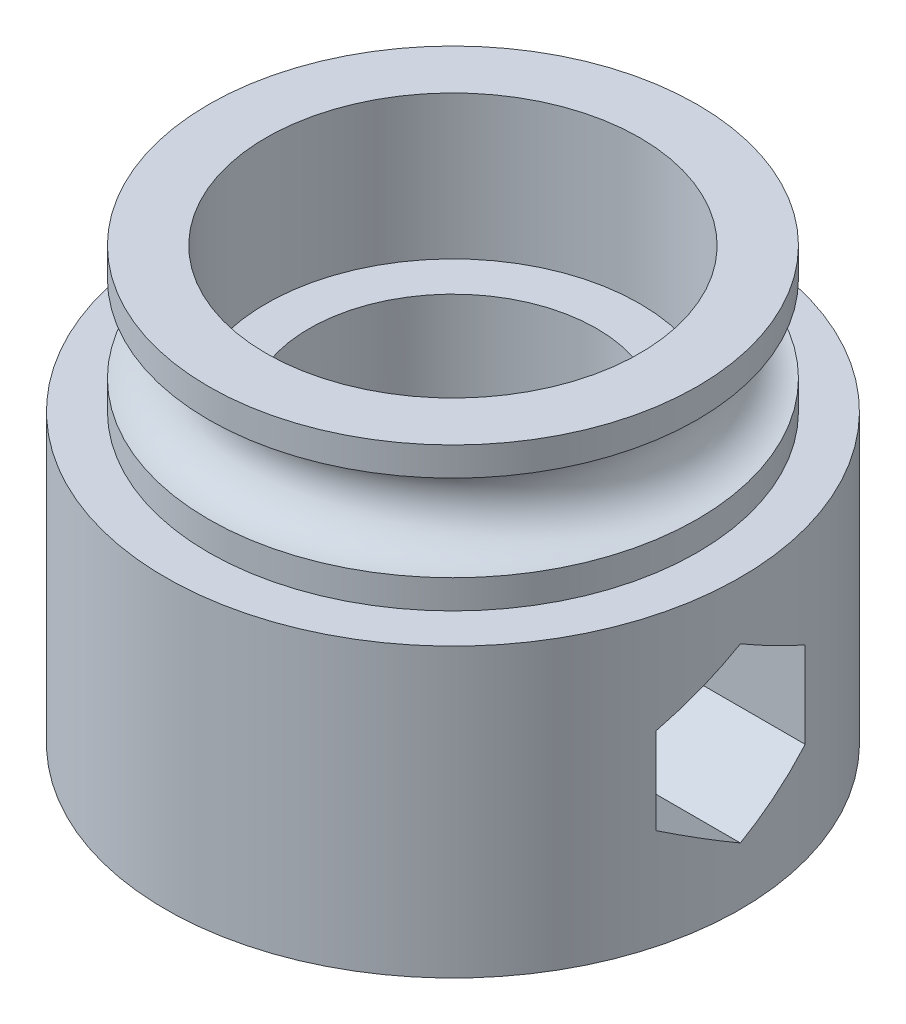
ISO-10303-21;
HEADER;
FILE_DESCRIPTION(('STEP AP214'),'2;1');
FILE_NAME('part.step','',(''),(''),'','','');
FILE_SCHEMA(('AUTOMOTIVE_DESIGN { 1 0 10303 214 1 1 1 1 }'));
ENDSEC;
DATA;
#1=APPLICATION_CONTEXT('core data for automotive mechanical design processes');
#2=APPLICATION_PROTOCOL_DEFINITION('international standard','automotive_design',2000,#1);
#3=PRODUCT_CONTEXT('',#1,'mechanical');
#4=PRODUCT('Part','Part','',(#3));
#5=PRODUCT_RELATED_PRODUCT_CATEGORY('part','',(#4));
#6=PRODUCT_DEFINITION_FORMATION('','',#4);
#7=PRODUCT_DEFINITION_CONTEXT('part definition',#1,'design');
#8=PRODUCT_DEFINITION('design','',#6,#7);
#9=PRODUCT_DEFINITION_SHAPE('','',#8);
#10=(LENGTH_UNIT() NAMED_UNIT(*) SI_UNIT(.MILLI.,.METRE.));
#11=(NAMED_UNIT(*) PLANE_ANGLE_UNIT() SI_UNIT($,.RADIAN.));
#12=(NAMED_UNIT(*) SI_UNIT($,.STERADIAN.) SOLID_ANGLE_UNIT());
#13=UNCERTAINTY_MEASURE_WITH_UNIT(LENGTH_MEASURE(1.E-05),#10,'distance_accuracy_value','');
#14=(GEOMETRIC_REPRESENTATION_CONTEXT(3) GLOBAL_UNCERTAINTY_ASSIGNED_CONTEXT((#13)) GLOBAL_UNIT_ASSIGNED_CONTEXT((#10,
#11,#12)) REPRESENTATION_CONTEXT('',''));
#15=CARTESIAN_POINT('',(0.,0.,0.));
#16=DIRECTION('',(0.,0.,1.));
#17=DIRECTION('',(1.,0.,0.));
#18=AXIS2_PLACEMENT_3D('',#15,#16,#17);
#19=CARTESIAN_POINT('',(0.,31.75,0.));
#20=DIRECTION('',(0.,-1.,0.));
#21=DIRECTION('',(0.,0.,-1.));
#22=AXIS2_PLACEMENT_3D('',#19,#20,#21);
#23=TOROIDAL_SURFACE('',#22,21.59,3.80999999999999);
#24=CARTESIAN_POINT('',(0.,27.94,0.));
#25=DIRECTION('',(0.,-1.,0.));
#26=DIRECTION('',(0.,0.,-1.));
#27=AXIS2_PLACEMENT_3D('',#24,#25,#26);
#28=CIRCLE('',#27,21.59);
#29=CARTESIAN_POINT('',(0.,27.94,-21.59));
#30=VERTEX_POINT('',#29);
#31=EDGE_CURVE('E206',#30,#30,#28,.T.);
#32=ORIENTED_EDGE('',*,*,#31,.F.);
#33=EDGE_LOOP('',(#32));
#34=FACE_BOUND('',#33,.T.);
#35=CARTESIAN_POINT('',(0.,35.56,0.));
#36=DIRECTION('',(0.,-1.,0.));
#37=DIRECTION('',(0.,0.,-1.));
#38=AXIS2_PLACEMENT_3D('',#35,#36,#37);
#39=CIRCLE('',#38,21.59);
#40=CARTESIAN_POINT('',(0.,35.56,-21.59));
#41=VERTEX_POINT('',#40);
#42=EDGE_CURVE('E179',#41,#41,#39,.T.);
#43=ORIENTED_EDGE('',*,*,#42,.T.);
#44=EDGE_LOOP('',(#43));
#45=FACE_BOUND('',#44,.T.);
#46=ADVANCED_FACE('F45',(#34,#45),#23,.F.);
#47=CARTESIAN_POINT('',(0.,0.,0.));
#48=DIRECTION('',(0.,-1.,0.));
#49=DIRECTION('',(0.,0.,-1.));
#50=AXIS2_PLACEMENT_3D('',#47,#48,#49);
#51=CYLINDRICAL_SURFACE('',#50,21.59);
#52=ORIENTED_EDGE('',*,*,#42,.F.);
#53=EDGE_LOOP('',(#52));
#54=FACE_BOUND('',#53,.T.);
#55=CARTESIAN_POINT('',(0.,38.1,0.));
#56=DIRECTION('',(0.,-1.,0.));
#57=DIRECTION('',(0.,0.,-1.));
#58=AXIS2_PLACEMENT_3D('',#55,#56,#57);
#59=CIRCLE('',#58,21.59);
#60=CARTESIAN_POINT('',(0.,38.1,-21.59));
#61=VERTEX_POINT('',#60);
#62=EDGE_CURVE('E182',#61,#61,#59,.T.);
#63=ORIENTED_EDGE('',*,*,#62,.T.);
#64=EDGE_LOOP('',(#63));
#65=FACE_BOUND('',#64,.T.);
#66=ADVANCED_FACE('F283',(#54,#65),#51,.T.);
#67=CARTESIAN_POINT('',(0.,38.1,0.));
#68=DIRECTION('',(0.,-1.,0.));
#69=DIRECTION('',(0.,0.,-1.));
#70=AXIS2_PLACEMENT_3D('',#67,#68,#69);
#71=PLANE('',#70);
#72=ORIENTED_EDGE('',*,*,#62,.F.);
#73=EDGE_LOOP('',(#72));
#74=FACE_BOUND('',#73,.T.);
#75=CARTESIAN_POINT('',(0.,38.1,0.));
#76=DIRECTION('',(0.,-1.,0.));
#77=DIRECTION('',(0.,0.,-1.));
#78=AXIS2_PLACEMENT_3D('',#75,#76,#77);
#79=CIRCLE('',#78,16.51);
#80=CARTESIAN_POINT('',(0.,38.1,-16.51));
#81=VERTEX_POINT('',#80);
#82=EDGE_CURVE('E185',#81,#81,#79,.T.);
#83=ORIENTED_EDGE('',*,*,#82,.T.);
#84=EDGE_LOOP('',(#83));
#85=FACE_BOUND('',#84,.T.);
#86=ADVANCED_FACE('F288',(#74,#85),#71,.F.);
#87=CARTESIAN_POINT('',(0.,0.,0.));
#88=DIRECTION('',(0.,-1.,0.));
#89=DIRECTION('',(0.,0.,-1.));
#90=AXIS2_PLACEMENT_3D('',#87,#88,#89);
#91=CYLINDRICAL_SURFACE('',#90,16.51);
#92=ORIENTED_EDGE('',*,*,#82,.F.);
#93=EDGE_LOOP('',(#92));
#94=FACE_BOUND('',#93,.T.);
#95=CARTESIAN_POINT('',(0.,25.4,0.));
#96=DIRECTION('',(0.,-1.,0.));
#97=DIRECTION('',(0.,0.,-1.));
#98=AXIS2_PLACEMENT_3D('',#95,#96,#97);
#99=CIRCLE('',#98,16.51);
#100=CARTESIAN_POINT('',(0.,25.4,-16.51));
#101=VERTEX_POINT('',#100);
#102=EDGE_CURVE('E188',#101,#101,#99,.T.);
#103=ORIENTED_EDGE('',*,*,#102,.T.);
#104=EDGE_LOOP('',(#103));
#105=FACE_BOUND('',#104,.T.);
#106=ADVANCED_FACE('F298',(#94,#105),#91,.F.);
#107=CARTESIAN_POINT('',(0.,25.4,0.));
#108=DIRECTION('',(0.,-1.,0.));
#109=DIRECTION('',(0.,0.,-1.));
#110=AXIS2_PLACEMENT_3D('',#107,#108,#109);
#111=PLANE('',#110);
#112=ORIENTED_EDGE('',*,*,#102,.F.);
#113=EDGE_LOOP('',(#112));
#114=FACE_BOUND('',#113,.T.);
#115=CARTESIAN_POINT('',(0.,25.4,0.));
#116=DIRECTION('',(0.,-1.,0.));
#117=DIRECTION('',(0.,0.,-1.));
#118=AXIS2_PLACEMENT_3D('',#115,#116,#117);
#119=CIRCLE('',#118,12.7);
#120=CARTESIAN_POINT('',(0.,25.4,-12.7));
#121=VERTEX_POINT('',#120);
#122=EDGE_CURVE('E191',#121,#121,#119,.T.);
#123=ORIENTED_EDGE('',*,*,#122,.T.);
#124=EDGE_LOOP('',(#123));
#125=FACE_BOUND('',#124,.T.);
#126=ADVANCED_FACE('F304',(#114,#125),#111,.F.);
#127=CARTESIAN_POINT('',(0.,0.,0.));
#128=DIRECTION('',(0.,-1.,0.));
#129=DIRECTION('',(0.,0.,-1.));
#130=AXIS2_PLACEMENT_3D('',#127,#128,#129);
#131=CYLINDRICAL_SURFACE('',#130,12.7);
#132=CARTESIAN_POINT('',(0.,20.32,0.));
#133=DIRECTION('',(0.,0.866025403784439,0.5));
#134=DIRECTION('',(0.,-0.5,0.866025403784439));
#135=AXIS2_PLACEMENT_3D('',#132,#133,#134);
#136=ELLIPSE('',#135,14.6646968374165,12.7);
#137=CARTESIAN_POINT('',(-10.8508847565533,16.51,6.59911357683742));
#138=VERTEX_POINT('',#137);
#139=CARTESIAN_POINT('',(-12.7,20.32,0.));
#140=VERTEX_POINT('',#139);
#141=EDGE_CURVE('E231',#138,#140,#136,.F.);
#142=ORIENTED_EDGE('',*,*,#141,.T.);
#143=CARTESIAN_POINT('',(0.,20.32,0.));
#144=DIRECTION('',(0.,0.866025403784439,-0.5));
#145=DIRECTION('',(0.,-0.5,-0.866025403784439));
#146=AXIS2_PLACEMENT_3D('',#143,#144,#145);
#147=ELLIPSE('',#146,14.6646968374165,12.7);
#148=CARTESIAN_POINT('',(-10.8508847565533,16.51,-6.59911357683742));
#149=VERTEX_POINT('',#148);
#150=EDGE_CURVE('E210',#140,#149,#147,.F.);
#151=ORIENTED_EDGE('',*,*,#150,.T.);
#152=DIRECTION('',(0.,-1.,0.));
#153=VECTOR('',#152,1.);
#154=CARTESIAN_POINT('',(-10.8508847565533,0.,-6.59911357683742));
#155=LINE('',#154,#153);
#156=CARTESIAN_POINT('',(-10.8508847565533,8.89,-6.59911357683742));
#157=VERTEX_POINT('',#156);
#158=EDGE_CURVE('E216',#149,#157,#155,.T.);
#159=ORIENTED_EDGE('',*,*,#158,.T.);
#160=CARTESIAN_POINT('',(0.,5.08,0.));
#161=DIRECTION('',(0.,-0.866025403784438,-0.5));
#162=DIRECTION('',(0.,-0.5,0.866025403784439));
#163=AXIS2_PLACEMENT_3D('',#160,#161,#162);
#164=ELLIPSE('',#163,14.6646968374165,12.7);
#165=CARTESIAN_POINT('',(-12.7,5.08,0.));
#166=VERTEX_POINT('',#165);
#167=EDGE_CURVE('E219',#157,#166,#164,.F.);
#168=ORIENTED_EDGE('',*,*,#167,.T.);
#169=CARTESIAN_POINT('',(0.,5.08,0.));
#170=DIRECTION('',(0.,-0.866025403784438,0.5));
#171=DIRECTION('',(0.,-0.5,-0.866025403784439));
#172=AXIS2_PLACEMENT_3D('',#169,#170,#171);
#173=ELLIPSE('',#172,14.6646968374165,12.7);
#174=CARTESIAN_POINT('',(-10.8508847565533,8.89,6.59911357683742));
#175=VERTEX_POINT('',#174);
#176=EDGE_CURVE('E222',#166,#175,#173,.F.);
#177=ORIENTED_EDGE('',*,*,#176,.T.);
#178=DIRECTION('',(0.,-1.,0.));
#179=VECTOR('',#178,1.);
#180=CARTESIAN_POINT('',(-10.8508847565533,0.,6.59911357683742));
#181=LINE('',#180,#179);
#182=EDGE_CURVE('E225',#175,#138,#181,.F.);
#183=ORIENTED_EDGE('',*,*,#182,.T.);
#184=EDGE_LOOP('',(#142,#151,#159,#168,#177,#183));
#185=FACE_BOUND('',#184,.T.);
#186=DIRECTION('',(0.,-1.,0.));
#187=VECTOR('',#186,1.);
#188=CARTESIAN_POINT('',(10.8508847565533,0.,-6.59911357683742));
#189=LINE('',#188,#187);
#190=CARTESIAN_POINT('',(10.8508847565533,8.89,-6.59911357683742));
#191=VERTEX_POINT('',#190);
#192=CARTESIAN_POINT('',(10.8508847565533,16.51,-6.59911357683742));
#193=VERTEX_POINT('',#192);
#194=EDGE_CURVE('E213',#191,#193,#189,.F.);
#195=ORIENTED_EDGE('',*,*,#194,.T.);
#196=CARTESIAN_POINT('',(12.7,20.32,0.));
#197=VERTEX_POINT('',#196);
#198=EDGE_CURVE('E209',#193,#197,#147,.F.);
#199=ORIENTED_EDGE('',*,*,#198,.T.);
#200=CARTESIAN_POINT('',(10.8508847565533,16.51,6.59911357683742));
#201=VERTEX_POINT('',#200);
#202=EDGE_CURVE('E232',#197,#201,#136,.F.);
#203=ORIENTED_EDGE('',*,*,#202,.T.);
#204=DIRECTION('',(0.,-1.,0.));
#205=VECTOR('',#204,1.);
#206=CARTESIAN_POINT('',(10.8508847565533,0.,6.59911357683742));
#207=LINE('',#206,#205);
#208=CARTESIAN_POINT('',(10.8508847565533,8.89,6.59911357683742));
#209=VERTEX_POINT('',#208);
#210=EDGE_CURVE('E228',#201,#209,#207,.T.);
#211=ORIENTED_EDGE('',*,*,#210,.T.);
#212=CARTESIAN_POINT('',(12.7,5.08,0.));
#213=VERTEX_POINT('',#212);
#214=EDGE_CURVE('E223',#209,#213,#173,.F.);
#215=ORIENTED_EDGE('',*,*,#214,.T.);
#216=EDGE_CURVE('E155',#213,#191,#164,.F.);
#217=ORIENTED_EDGE('',*,*,#216,.T.);
#218=EDGE_LOOP('',(#195,#199,#203,#211,#215,#217));
#219=FACE_BOUND('',#218,.T.);
#220=ORIENTED_EDGE('',*,*,#122,.F.);
#221=EDGE_LOOP('',(#220));
#222=FACE_BOUND('',#221,.T.);
#223=CARTESIAN_POINT('',(0.,0.,0.));
#224=DIRECTION('',(0.,-1.,0.));
#225=DIRECTION('',(0.,0.,-1.));
#226=AXIS2_PLACEMENT_3D('',#223,#224,#225);
#227=CIRCLE('',#226,12.7);
#228=CARTESIAN_POINT('',(0.,0.,-12.7));
#229=VERTEX_POINT('',#228);
#230=EDGE_CURVE('E194',#229,#229,#227,.T.);
#231=ORIENTED_EDGE('',*,*,#230,.T.);
#232=EDGE_LOOP('',(#231));
#233=FACE_BOUND('',#232,.T.);
#234=ADVANCED_FACE('F259',(#185,#219,#222,#233),#131,.F.);
#235=CARTESIAN_POINT('',(0.,0.,0.));
#236=DIRECTION('',(0.,-1.,0.));
#237=DIRECTION('',(0.,0.,-1.));
#238=AXIS2_PLACEMENT_3D('',#235,#236,#237);
#239=PLANE('',#238);
#240=CARTESIAN_POINT('',(0.,0.,0.));
#241=DIRECTION('',(0.,-1.,0.));
#242=DIRECTION('',(0.,0.,-1.));
#243=AXIS2_PLACEMENT_3D('',#240,#241,#242);
#244=CIRCLE('',#243,25.4);
#245=CARTESIAN_POINT('',(0.,0.,-25.4));
#246=VERTEX_POINT('',#245);
#247=EDGE_CURVE('E197',#246,#246,#244,.T.);
#248=ORIENTED_EDGE('',*,*,#247,.T.);
#249=EDGE_LOOP('',(#248));
#250=FACE_BOUND('',#249,.T.);
#251=ORIENTED_EDGE('',*,*,#230,.F.);
#252=EDGE_LOOP('',(#251));
#253=FACE_BOUND('',#252,.T.);
#254=ADVANCED_FACE('F314',(#250,#253),#239,.T.);
#255=CARTESIAN_POINT('',(0.,0.,0.));
#256=DIRECTION('',(0.,-1.,0.));
#257=DIRECTION('',(0.,0.,-1.));
#258=AXIS2_PLACEMENT_3D('',#255,#256,#257);
#259=CYLINDRICAL_SURFACE('',#258,25.4);
#260=DIRECTION('',(0.,-1.,0.));
#261=VECTOR('',#260,1.);
#262=CARTESIAN_POINT('',(-24.5277740531015,0.,-6.59911357683742));
#263=LINE('',#262,#261);
#264=CARTESIAN_POINT('',(-24.5277740531015,8.89,-6.59911357683742));
#265=VERTEX_POINT('',#264);
#266=CARTESIAN_POINT('',(-24.5277740531015,16.51,-6.59911357683742));
#267=VERTEX_POINT('',#266);
#268=EDGE_CURVE('E48',#265,#267,#263,.F.);
#269=ORIENTED_EDGE('',*,*,#268,.T.);
#270=CARTESIAN_POINT('',(0.,20.32,0.));
#271=DIRECTION('',(0.,0.866025403784439,-0.5));
#272=DIRECTION('',(0.,-0.5,-0.866025403784439));
#273=AXIS2_PLACEMENT_3D('',#270,#271,#272);
#274=ELLIPSE('',#273,29.329393674833,25.4);
#275=CARTESIAN_POINT('',(-25.4,20.32,0.));
#276=VERTEX_POINT('',#275);
#277=EDGE_CURVE('E11',#267,#276,#274,.T.);
#278=ORIENTED_EDGE('',*,*,#277,.T.);
#279=CARTESIAN_POINT('',(0.,20.32,0.));
#280=DIRECTION('',(0.,0.866025403784439,0.5));
#281=DIRECTION('',(0.,-0.5,0.866025403784439));
#282=AXIS2_PLACEMENT_3D('',#279,#280,#281);
#283=ELLIPSE('',#282,29.329393674833,25.4);
#284=CARTESIAN_POINT('',(-24.5277740531015,16.51,6.59911357683742));
#285=VERTEX_POINT('',#284);
#286=EDGE_CURVE('E174',#276,#285,#283,.T.);
#287=ORIENTED_EDGE('',*,*,#286,.T.);
#288=DIRECTION('',(0.,-1.,0.));
#289=VECTOR('',#288,1.);
#290=CARTESIAN_POINT('',(-24.5277740531015,0.,6.59911357683742));
#291=LINE('',#290,#289);
#292=CARTESIAN_POINT('',(-24.5277740531015,8.89,6.59911357683742));
#293=VERTEX_POINT('',#292);
#294=EDGE_CURVE('E172',#285,#293,#291,.T.);
#295=ORIENTED_EDGE('',*,*,#294,.T.);
#296=CARTESIAN_POINT('',(0.,5.08,0.));
#297=DIRECTION('',(0.,-0.866025403784438,0.5));
#298=DIRECTION('',(0.,-0.5,-0.866025403784439));
#299=AXIS2_PLACEMENT_3D('',#296,#297,#298);
#300=ELLIPSE('',#299,29.329393674833,25.4);
#301=CARTESIAN_POINT('',(-25.4,5.08,0.));
#302=VERTEX_POINT('',#301);
#303=EDGE_CURVE('E149',#293,#302,#300,.T.);
#304=ORIENTED_EDGE('',*,*,#303,.T.);
#305=CARTESIAN_POINT('',(0.,5.08,0.));
#306=DIRECTION('',(0.,-0.866025403784438,-0.5));
#307=DIRECTION('',(0.,-0.5,0.866025403784439));
#308=AXIS2_PLACEMENT_3D('',#305,#306,#307);
#309=ELLIPSE('',#308,29.329393674833,25.4);
#310=EDGE_CURVE('E166',#302,#265,#309,.T.);
#311=ORIENTED_EDGE('',*,*,#310,.T.);
#312=EDGE_LOOP('',(#269,#278,#287,#295,#304,#311));
#313=FACE_BOUND('',#312,.T.);
#314=CARTESIAN_POINT('',(24.5277740531015,16.51,6.59911357683742));
#315=VERTEX_POINT('',#314);
#316=CARTESIAN_POINT('',(25.4,20.32,0.));
#317=VERTEX_POINT('',#316);
#318=EDGE_CURVE('E177',#315,#317,#283,.T.);
#319=ORIENTED_EDGE('',*,*,#318,.T.);
#320=CARTESIAN_POINT('',(24.5277740531015,16.51,-6.59911357683742));
#321=VERTEX_POINT('',#320);
#322=EDGE_CURVE('E54',#317,#321,#274,.T.);
#323=ORIENTED_EDGE('',*,*,#322,.T.);
#324=DIRECTION('',(0.,-1.,0.));
#325=VECTOR('',#324,1.);
#326=CARTESIAN_POINT('',(24.5277740531015,0.,-6.59911357683742));
#327=LINE('',#326,#325);
#328=CARTESIAN_POINT('',(24.5277740531015,8.89,-6.59911357683742));
#329=VERTEX_POINT('',#328);
#330=EDGE_CURVE('E164',#321,#329,#327,.T.);
#331=ORIENTED_EDGE('',*,*,#330,.T.);
#332=CARTESIAN_POINT('',(25.4,5.08,0.));
#333=VERTEX_POINT('',#332);
#334=EDGE_CURVE('E146',#329,#333,#309,.T.);
#335=ORIENTED_EDGE('',*,*,#334,.T.);
#336=CARTESIAN_POINT('',(24.5277740531015,8.89,6.59911357683742));
#337=VERTEX_POINT('',#336);
#338=EDGE_CURVE('E136',#333,#337,#300,.T.);
#339=ORIENTED_EDGE('',*,*,#338,.T.);
#340=DIRECTION('',(0.,-1.,0.));
#341=VECTOR('',#340,1.);
#342=CARTESIAN_POINT('',(24.5277740531015,0.,6.59911357683742));
#343=LINE('',#342,#341);
#344=EDGE_CURVE('E147',#337,#315,#343,.F.);
#345=ORIENTED_EDGE('',*,*,#344,.T.);
#346=EDGE_LOOP('',(#319,#323,#331,#335,#339,#345));
#347=FACE_BOUND('',#346,.T.);
#348=ORIENTED_EDGE('',*,*,#247,.F.);
#349=EDGE_LOOP('',(#348));
#350=FACE_BOUND('',#349,.T.);
#351=CARTESIAN_POINT('',(0.,25.4,0.));
#352=DIRECTION('',(0.,-1.,0.));
#353=DIRECTION('',(0.,0.,-1.));
#354=AXIS2_PLACEMENT_3D('',#351,#352,#353);
#355=CIRCLE('',#354,25.4);
#356=CARTESIAN_POINT('',(0.,25.4,-25.4));
#357=VERTEX_POINT('',#356);
#358=EDGE_CURVE('E200',#357,#357,#355,.T.);
#359=ORIENTED_EDGE('',*,*,#358,.T.);
#360=EDGE_LOOP('',(#359));
#361=FACE_BOUND('',#360,.T.);
#362=ADVANCED_FACE('F161',(#313,#347,#350,#361),#259,.T.);
#363=CARTESIAN_POINT('',(0.,25.4,0.));
#364=DIRECTION('',(0.,-1.,0.));
#365=DIRECTION('',(0.,0.,-1.));
#366=AXIS2_PLACEMENT_3D('',#363,#364,#365);
#367=PLANE('',#366);
#368=ORIENTED_EDGE('',*,*,#358,.F.);
#369=EDGE_LOOP('',(#368));
#370=FACE_BOUND('',#369,.T.);
#371=CARTESIAN_POINT('',(0.,25.4,0.));
#372=DIRECTION('',(0.,-1.,0.));
#373=DIRECTION('',(0.,0.,-1.));
#374=AXIS2_PLACEMENT_3D('',#371,#372,#373);
#375=CIRCLE('',#374,21.59);
#376=CARTESIAN_POINT('',(0.,25.4,-21.59));
#377=VERTEX_POINT('',#376);
#378=EDGE_CURVE('E203',#377,#377,#375,.T.);
#379=ORIENTED_EDGE('',*,*,#378,.T.);
#380=EDGE_LOOP('',(#379));
#381=FACE_BOUND('',#380,.T.);
#382=ADVANCED_FACE('F325',(#370,#381),#367,.F.);
#383=CARTESIAN_POINT('',(0.,0.,0.));
#384=DIRECTION('',(0.,-1.,0.));
#385=DIRECTION('',(0.,0.,-1.));
#386=AXIS2_PLACEMENT_3D('',#383,#384,#385);
#387=CYLINDRICAL_SURFACE('',#386,21.59);
#388=ORIENTED_EDGE('',*,*,#378,.F.);
#389=EDGE_LOOP('',(#388));
#390=FACE_BOUND('',#389,.T.);
#391=ORIENTED_EDGE('',*,*,#31,.T.);
#392=EDGE_LOOP('',(#391));
#393=FACE_BOUND('',#392,.T.);
#394=ADVANCED_FACE('F329',(#390,#393),#387,.T.);
#395=CARTESIAN_POINT('',(-25.4,20.32,0.));
#396=DIRECTION('',(0.,0.866025403784439,0.5));
#397=DIRECTION('',(0.,-0.5,0.866025403784439));
#398=AXIS2_PLACEMENT_3D('',#395,#396,#397);
#399=PLANE('',#398);
#400=DIRECTION('',(1.,0.,0.));
#401=VECTOR('',#400,1.);
#402=CARTESIAN_POINT('',(-25.4,16.51,6.59911357683742));
#403=LINE('',#402,#401);
#404=EDGE_CURVE('E239',#285,#138,#403,.T.);
#405=ORIENTED_EDGE('',*,*,#404,.F.);
#406=ORIENTED_EDGE('',*,*,#286,.F.);
#407=DIRECTION('',(1.,0.,0.));
#408=VECTOR('',#407,1.);
#409=CARTESIAN_POINT('',(-25.4,20.32,0.));
#410=LINE('',#409,#408);
#411=EDGE_CURVE('E61',#276,#140,#410,.T.);
#412=ORIENTED_EDGE('',*,*,#411,.T.);
#413=ORIENTED_EDGE('',*,*,#141,.F.);
#414=EDGE_LOOP('',(#405,#406,#412,#413));
#415=FACE_BOUND('',#414,.T.);
#416=ADVANCED_FACE('F332',(#415),#399,.F.);
#417=CARTESIAN_POINT('',(-25.4,16.51,6.59911357683742));
#418=DIRECTION('',(0.,0.,1.));
#419=DIRECTION('',(0.,-1.,0.));
#420=AXIS2_PLACEMENT_3D('',#417,#418,#419);
#421=PLANE('',#420);
#422=DIRECTION('',(1.,0.,0.));
#423=VECTOR('',#422,1.);
#424=CARTESIAN_POINT('',(-25.4,8.89,6.59911357683742));
#425=LINE('',#424,#423);
#426=EDGE_CURVE('E157',#293,#175,#425,.T.);
#427=ORIENTED_EDGE('',*,*,#426,.F.);
#428=ORIENTED_EDGE('',*,*,#294,.F.);
#429=ORIENTED_EDGE('',*,*,#404,.T.);
#430=ORIENTED_EDGE('',*,*,#182,.F.);
#431=EDGE_LOOP('',(#427,#428,#429,#430));
#432=FACE_BOUND('',#431,.T.);
#433=ADVANCED_FACE('F337',(#432),#421,.F.);
#434=CARTESIAN_POINT('',(-25.4,8.89,6.59911357683742));
#435=DIRECTION('',(0.,-0.866025403784438,0.5));
#436=DIRECTION('',(0.,-0.5,-0.866025403784439));
#437=AXIS2_PLACEMENT_3D('',#434,#435,#436);
#438=PLANE('',#437);
#439=DIRECTION('',(1.,0.,0.));
#440=VECTOR('',#439,1.);
#441=CARTESIAN_POINT('',(-25.4,5.08,0.));
#442=LINE('',#441,#440);
#443=EDGE_CURVE('E156',#302,#166,#442,.T.);
#444=ORIENTED_EDGE('',*,*,#443,.F.);
#445=ORIENTED_EDGE('',*,*,#303,.F.);
#446=ORIENTED_EDGE('',*,*,#426,.T.);
#447=ORIENTED_EDGE('',*,*,#176,.F.);
#448=EDGE_LOOP('',(#444,#445,#446,#447));
#449=FACE_BOUND('',#448,.T.);
#450=ADVANCED_FACE('F341',(#449),#438,.F.);
#451=CARTESIAN_POINT('',(-25.4,5.08,0.));
#452=DIRECTION('',(0.,-0.866025403784438,-0.5));
#453=DIRECTION('',(0.,0.5,-0.866025403784439));
#454=AXIS2_PLACEMENT_3D('',#451,#452,#453);
#455=PLANE('',#454);
#456=DIRECTION('',(1.,0.,0.));
#457=VECTOR('',#456,1.);
#458=CARTESIAN_POINT('',(-25.4,8.89,-6.59911357683742));
#459=LINE('',#458,#457);
#460=EDGE_CURVE('E244',#265,#157,#459,.T.);
#461=ORIENTED_EDGE('',*,*,#460,.F.);
#462=ORIENTED_EDGE('',*,*,#310,.F.);
#463=ORIENTED_EDGE('',*,*,#443,.T.);
#464=ORIENTED_EDGE('',*,*,#167,.F.);
#465=EDGE_LOOP('',(#461,#462,#463,#464));
#466=FACE_BOUND('',#465,.T.);
#467=ADVANCED_FACE('F279',(#466),#455,.F.);
#468=CARTESIAN_POINT('',(-25.4,8.89,-6.59911357683742));
#469=DIRECTION('',(0.,0.,-1.));
#470=DIRECTION('',(-1.,0.,0.));
#471=AXIS2_PLACEMENT_3D('',#468,#469,#470);
#472=PLANE('',#471);
#473=DIRECTION('',(1.,0.,0.));
#474=VECTOR('',#473,1.);
#475=CARTESIAN_POINT('',(-25.4,16.51,-6.59911357683742));
#476=LINE('',#475,#474);
#477=EDGE_CURVE('E235',#267,#149,#476,.T.);
#478=ORIENTED_EDGE('',*,*,#477,.F.);
#479=ORIENTED_EDGE('',*,*,#268,.F.);
#480=ORIENTED_EDGE('',*,*,#460,.T.);
#481=ORIENTED_EDGE('',*,*,#158,.F.);
#482=EDGE_LOOP('',(#478,#479,#480,#481));
#483=FACE_BOUND('',#482,.T.);
#484=ADVANCED_FACE('F255',(#483),#472,.F.);
#485=CARTESIAN_POINT('',(-25.4,16.51,-6.59911357683742));
#486=DIRECTION('',(0.,0.866025403784439,-0.5));
#487=DIRECTION('',(0.,0.5,0.866025403784439));
#488=AXIS2_PLACEMENT_3D('',#485,#486,#487);
#489=PLANE('',#488);
#490=ORIENTED_EDGE('',*,*,#411,.F.);
#491=ORIENTED_EDGE('',*,*,#277,.F.);
#492=ORIENTED_EDGE('',*,*,#477,.T.);
#493=ORIENTED_EDGE('',*,*,#150,.F.);
#494=EDGE_LOOP('',(#490,#491,#492,#493));
#495=FACE_BOUND('',#494,.T.);
#496=ADVANCED_FACE('F263',(#495),#489,.F.);
#497=EDGE_CURVE('E245',#193,#321,#476,.T.);
#498=ORIENTED_EDGE('',*,*,#497,.T.);
#499=ORIENTED_EDGE('',*,*,#322,.F.);
#500=EDGE_CURVE('E237',#197,#317,#410,.T.);
#501=ORIENTED_EDGE('',*,*,#500,.F.);
#502=ORIENTED_EDGE('',*,*,#198,.F.);
#503=EDGE_LOOP('',(#498,#499,#501,#502));
#504=FACE_BOUND('',#503,.T.);
#505=ADVANCED_FACE('F267',(#504),#489,.F.);
#506=EDGE_CURVE('E242',#191,#329,#459,.T.);
#507=ORIENTED_EDGE('',*,*,#506,.T.);
#508=ORIENTED_EDGE('',*,*,#330,.F.);
#509=ORIENTED_EDGE('',*,*,#497,.F.);
#510=ORIENTED_EDGE('',*,*,#194,.F.);
#511=EDGE_LOOP('',(#507,#508,#509,#510));
#512=FACE_BOUND('',#511,.T.);
#513=ADVANCED_FACE('F271',(#512),#472,.F.);
#514=EDGE_CURVE('E139',#213,#333,#442,.T.);
#515=ORIENTED_EDGE('',*,*,#514,.T.);
#516=ORIENTED_EDGE('',*,*,#334,.F.);
#517=ORIENTED_EDGE('',*,*,#506,.F.);
#518=ORIENTED_EDGE('',*,*,#216,.F.);
#519=EDGE_LOOP('',(#515,#516,#517,#518));
#520=FACE_BOUND('',#519,.T.);
#521=ADVANCED_FACE('F151',(#520),#455,.F.);
#522=EDGE_CURVE('E142',#209,#337,#425,.T.);
#523=ORIENTED_EDGE('',*,*,#522,.T.);
#524=ORIENTED_EDGE('',*,*,#338,.F.);
#525=ORIENTED_EDGE('',*,*,#514,.F.);
#526=ORIENTED_EDGE('',*,*,#214,.F.);
#527=EDGE_LOOP('',(#523,#524,#525,#526));
#528=FACE_BOUND('',#527,.T.);
#529=ADVANCED_FACE('F138',(#528),#438,.F.);
#530=EDGE_CURVE('E69',#201,#315,#403,.T.);
#531=ORIENTED_EDGE('',*,*,#530,.T.);
#532=ORIENTED_EDGE('',*,*,#344,.F.);
#533=ORIENTED_EDGE('',*,*,#522,.F.);
#534=ORIENTED_EDGE('',*,*,#210,.F.);
#535=EDGE_LOOP('',(#531,#532,#533,#534));
#536=FACE_BOUND('',#535,.T.);
#537=ADVANCED_FACE('F343',(#536),#421,.F.);
#538=ORIENTED_EDGE('',*,*,#500,.T.);
#539=ORIENTED_EDGE('',*,*,#318,.F.);
#540=ORIENTED_EDGE('',*,*,#530,.F.);
#541=ORIENTED_EDGE('',*,*,#202,.F.);
#542=EDGE_LOOP('',(#538,#539,#540,#541));
#543=FACE_BOUND('',#542,.T.);
#544=ADVANCED_FACE('F338',(#543),#399,.F.);
#545=CLOSED_SHELL('',(#46,#66,#86,#106,#126,#234,#254,#362,#382,#394,#416,#433,#450,#467,#484,
#496,#505,#513,#521,#529,#537,#544));
#546=MANIFOLD_SOLID_BREP('B2',#545);
#547=ADVANCED_BREP_SHAPE_REPRESENTATION('',(#18,#546),#14);
#548=SHAPE_DEFINITION_REPRESENTATION(#9,#547);
ENDSEC;
END-ISO-10303-21;
